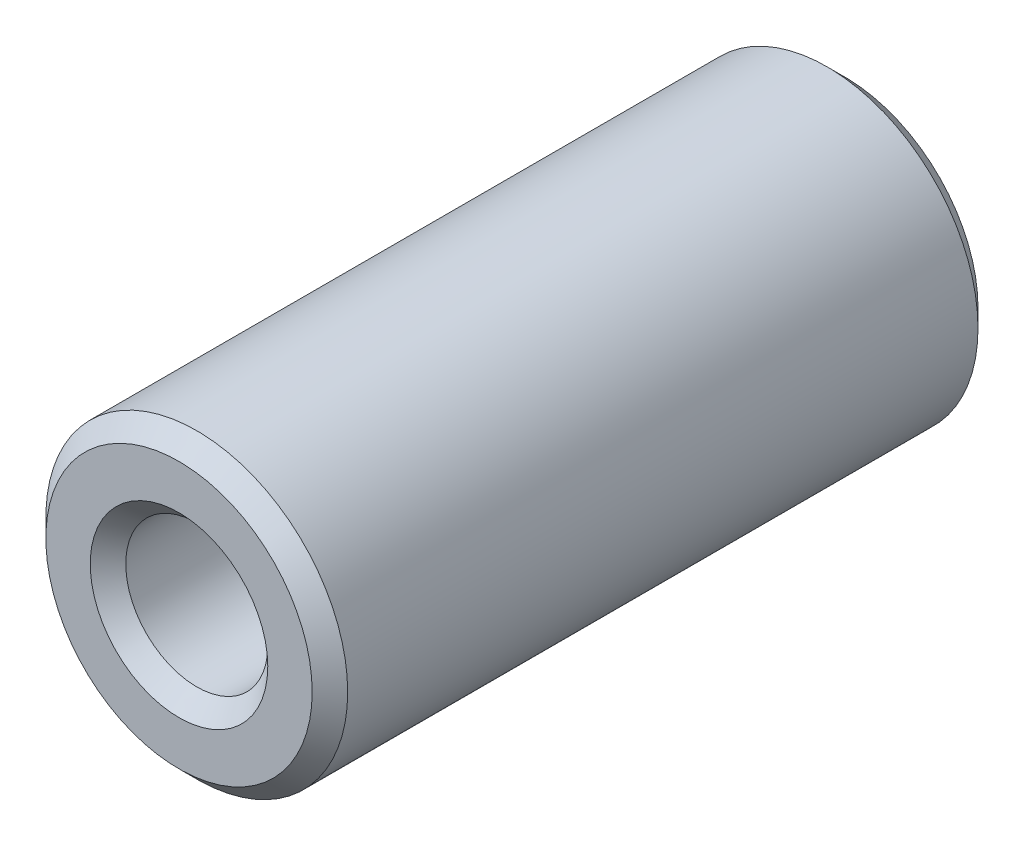
ISO-10303-21;
HEADER;
FILE_DESCRIPTION(('STEP AP214'),'2;1');
FILE_NAME('part.step','',(''),(''),'','','');
FILE_SCHEMA(('AUTOMOTIVE_DESIGN { 1 0 10303 214 1 1 1 1 }'));
ENDSEC;
DATA;
#1=APPLICATION_CONTEXT('core data for automotive mechanical design processes');
#2=APPLICATION_PROTOCOL_DEFINITION('international standard','automotive_design',2000,#1);
#3=PRODUCT_CONTEXT('',#1,'mechanical');
#4=PRODUCT('Part','Part','',(#3));
#5=PRODUCT_RELATED_PRODUCT_CATEGORY('part','',(#4));
#6=PRODUCT_DEFINITION_FORMATION('','',#4);
#7=PRODUCT_DEFINITION_CONTEXT('part definition',#1,'design');
#8=PRODUCT_DEFINITION('design','',#6,#7);
#9=PRODUCT_DEFINITION_SHAPE('','',#8);
#10=(LENGTH_UNIT() NAMED_UNIT(*) SI_UNIT(.MILLI.,.METRE.));
#11=(NAMED_UNIT(*) PLANE_ANGLE_UNIT() SI_UNIT($,.RADIAN.));
#12=(NAMED_UNIT(*) SI_UNIT($,.STERADIAN.) SOLID_ANGLE_UNIT());
#13=UNCERTAINTY_MEASURE_WITH_UNIT(LENGTH_MEASURE(1.E-05),#10,'distance_accuracy_value','');
#14=(GEOMETRIC_REPRESENTATION_CONTEXT(3) GLOBAL_UNCERTAINTY_ASSIGNED_CONTEXT((#13)) GLOBAL_UNIT_ASSIGNED_CONTEXT((#10,
#11,#12)) REPRESENTATION_CONTEXT('',''));
#15=CARTESIAN_POINT('',(0.,0.,0.));
#16=DIRECTION('',(0.,0.,1.));
#17=DIRECTION('',(1.,0.,0.));
#18=AXIS2_PLACEMENT_3D('',#15,#16,#17);
#19=CARTESIAN_POINT('',(0.,0.,75.));
#20=DIRECTION('',(0.,0.,1.));
#21=DIRECTION('',(1.,0.,0.));
#22=AXIS2_PLACEMENT_3D('',#19,#20,#21);
#23=PLANE('',#22);
#24=CARTESIAN_POINT('',(0.,0.,75.));
#25=DIRECTION('',(0.,0.,1.));
#26=DIRECTION('',(1.,0.,0.));
#27=AXIS2_PLACEMENT_3D('',#24,#25,#26);
#28=CIRCLE('',#27,10.);
#29=CARTESIAN_POINT('',(10.,0.,75.));
#30=VERTEX_POINT('',#29);
#31=EDGE_CURVE('E49',#30,#30,#28,.F.);
#32=ORIENTED_EDGE('',*,*,#31,.T.);
#33=EDGE_LOOP('',(#32));
#34=FACE_BOUND('',#33,.T.);
#35=CARTESIAN_POINT('',(0.,0.,75.));
#36=DIRECTION('',(0.,0.,1.));
#37=DIRECTION('',(1.,0.,0.));
#38=AXIS2_PLACEMENT_3D('',#35,#36,#37);
#39=CIRCLE('',#38,15.);
#40=CARTESIAN_POINT('',(15.,0.,75.));
#41=VERTEX_POINT('',#40);
#42=EDGE_CURVE('E53',#41,#41,#39,.T.);
#43=ORIENTED_EDGE('',*,*,#42,.T.);
#44=EDGE_LOOP('',(#43));
#45=FACE_BOUND('',#44,.T.);
#46=ADVANCED_FACE('F37',(#34,#45),#23,.T.);
#47=CARTESIAN_POINT('',(0.,0.,0.));
#48=DIRECTION('',(0.,0.,1.));
#49=DIRECTION('',(1.,0.,0.));
#50=AXIS2_PLACEMENT_3D('',#47,#48,#49);
#51=PLANE('',#50);
#52=CARTESIAN_POINT('',(0.,0.,0.));
#53=DIRECTION('',(0.,0.,1.));
#54=DIRECTION('',(1.,0.,0.));
#55=AXIS2_PLACEMENT_3D('',#52,#53,#54);
#56=CIRCLE('',#55,10.);
#57=CARTESIAN_POINT('',(10.,0.,0.));
#58=VERTEX_POINT('',#57);
#59=EDGE_CURVE('E64',#58,#58,#56,.T.);
#60=ORIENTED_EDGE('',*,*,#59,.T.);
#61=EDGE_LOOP('',(#60));
#62=FACE_BOUND('',#61,.T.);
#63=CARTESIAN_POINT('',(0.,0.,0.));
#64=DIRECTION('',(0.,0.,1.));
#65=DIRECTION('',(1.,0.,0.));
#66=AXIS2_PLACEMENT_3D('',#63,#64,#65);
#67=CIRCLE('',#66,15.);
#68=CARTESIAN_POINT('',(15.,0.,0.));
#69=VERTEX_POINT('',#68);
#70=EDGE_CURVE('E67',#69,#69,#67,.F.);
#71=ORIENTED_EDGE('',*,*,#70,.T.);
#72=EDGE_LOOP('',(#71));
#73=FACE_BOUND('',#72,.T.);
#74=ADVANCED_FACE('F71',(#62,#73),#51,.F.);
#75=CARTESIAN_POINT('',(0.,0.,75.));
#76=DIRECTION('',(0.,0.,-1.));
#77=DIRECTION('',(-1.,0.,0.));
#78=AXIS2_PLACEMENT_3D('',#75,#76,#77);
#79=CYLINDRICAL_SURFACE('',#78,17.);
#80=CARTESIAN_POINT('',(0.,0.,73.));
#81=DIRECTION('',(0.,0.,1.));
#82=DIRECTION('',(1.,0.,0.));
#83=AXIS2_PLACEMENT_3D('',#80,#81,#82);
#84=CIRCLE('',#83,17.);
#85=CARTESIAN_POINT('',(17.,0.,73.));
#86=VERTEX_POINT('',#85);
#87=EDGE_CURVE('E11',#86,#86,#84,.F.);
#88=ORIENTED_EDGE('',*,*,#87,.T.);
#89=EDGE_LOOP('',(#88));
#90=FACE_BOUND('',#89,.T.);
#91=CARTESIAN_POINT('',(0.,0.,2.00000000000002));
#92=DIRECTION('',(0.,0.,1.));
#93=DIRECTION('',(1.,0.,0.));
#94=AXIS2_PLACEMENT_3D('',#91,#92,#93);
#95=CIRCLE('',#94,17.);
#96=CARTESIAN_POINT('',(17.,0.,2.00000000000002));
#97=VERTEX_POINT('',#96);
#98=EDGE_CURVE('E45',#97,#97,#95,.T.);
#99=ORIENTED_EDGE('',*,*,#98,.T.);
#100=EDGE_LOOP('',(#99));
#101=FACE_BOUND('',#100,.T.);
#102=ADVANCED_FACE('F87',(#90,#101),#79,.T.);
#103=CARTESIAN_POINT('',(0.,0.,75.));
#104=DIRECTION('',(0.,0.,-1.));
#105=DIRECTION('',(-1.,0.,0.));
#106=AXIS2_PLACEMENT_3D('',#103,#104,#105);
#107=CYLINDRICAL_SURFACE('',#106,8.);
#108=CARTESIAN_POINT('',(0.,0.,2.));
#109=DIRECTION('',(0.,0.,1.));
#110=DIRECTION('',(1.,0.,0.));
#111=AXIS2_PLACEMENT_3D('',#108,#109,#110);
#112=CIRCLE('',#111,8.);
#113=CARTESIAN_POINT('',(8.,0.,2.));
#114=VERTEX_POINT('',#113);
#115=EDGE_CURVE('E58',#114,#114,#112,.F.);
#116=ORIENTED_EDGE('',*,*,#115,.T.);
#117=EDGE_LOOP('',(#116));
#118=FACE_BOUND('',#117,.T.);
#119=CARTESIAN_POINT('',(0.,0.,73.));
#120=DIRECTION('',(0.,0.,1.));
#121=DIRECTION('',(1.,0.,0.));
#122=AXIS2_PLACEMENT_3D('',#119,#120,#121);
#123=CIRCLE('',#122,8.);
#124=CARTESIAN_POINT('',(8.,0.,73.));
#125=VERTEX_POINT('',#124);
#126=EDGE_CURVE('E61',#125,#125,#123,.T.);
#127=ORIENTED_EDGE('',*,*,#126,.T.);
#128=EDGE_LOOP('',(#127));
#129=FACE_BOUND('',#128,.T.);
#130=ADVANCED_FACE('F92',(#118,#129),#107,.F.);
#131=CARTESIAN_POINT('',(0.,0.,0.));
#132=DIRECTION('',(0.,0.,-1.));
#133=DIRECTION('',(-1.,0.,0.));
#134=AXIS2_PLACEMENT_3D('',#131,#132,#133);
#135=CONICAL_SURFACE('',#134,10.,0.785398163397448);
#136=ORIENTED_EDGE('',*,*,#115,.F.);
#137=EDGE_LOOP('',(#136));
#138=FACE_BOUND('',#137,.T.);
#139=ORIENTED_EDGE('',*,*,#59,.F.);
#140=EDGE_LOOP('',(#139));
#141=FACE_BOUND('',#140,.T.);
#142=ADVANCED_FACE('F97',(#138,#141),#135,.F.);
#143=CARTESIAN_POINT('',(0.,0.,73.));
#144=DIRECTION('',(0.,0.,1.));
#145=DIRECTION('',(1.,0.,0.));
#146=AXIS2_PLACEMENT_3D('',#143,#144,#145);
#147=CONICAL_SURFACE('',#146,8.,0.785398163397457);
#148=ORIENTED_EDGE('',*,*,#31,.F.);
#149=EDGE_LOOP('',(#148));
#150=FACE_BOUND('',#149,.T.);
#151=ORIENTED_EDGE('',*,*,#126,.F.);
#152=EDGE_LOOP('',(#151));
#153=FACE_BOUND('',#152,.T.);
#154=ADVANCED_FACE('F79',(#150,#153),#147,.F.);
#155=CARTESIAN_POINT('',(0.,0.,75.));
#156=DIRECTION('',(0.,0.,-1.));
#157=DIRECTION('',(-1.,0.,0.));
#158=AXIS2_PLACEMENT_3D('',#155,#156,#157);
#159=CONICAL_SURFACE('',#158,15.,0.785398163397448);
#160=ORIENTED_EDGE('',*,*,#87,.F.);
#161=EDGE_LOOP('',(#160));
#162=FACE_BOUND('',#161,.T.);
#163=ORIENTED_EDGE('',*,*,#42,.F.);
#164=EDGE_LOOP('',(#163));
#165=FACE_BOUND('',#164,.T.);
#166=ADVANCED_FACE('F75',(#162,#165),#159,.T.);
#167=CARTESIAN_POINT('',(0.,0.,2.00000000000002));
#168=DIRECTION('',(0.,0.,1.));
#169=DIRECTION('',(1.,0.,0.));
#170=AXIS2_PLACEMENT_3D('',#167,#168,#169);
#171=CONICAL_SURFACE('',#170,17.,0.785398163397448);
#172=ORIENTED_EDGE('',*,*,#70,.F.);
#173=EDGE_LOOP('',(#172));
#174=FACE_BOUND('',#173,.T.);
#175=ORIENTED_EDGE('',*,*,#98,.F.);
#176=EDGE_LOOP('',(#175));
#177=FACE_BOUND('',#176,.T.);
#178=ADVANCED_FACE('F40',(#174,#177),#171,.T.);
#179=CLOSED_SHELL('',(#46,#74,#102,#130,#142,#154,#166,#178));
#180=MANIFOLD_SOLID_BREP('B2',#179);
#181=ADVANCED_BREP_SHAPE_REPRESENTATION('',(#18,#180),#14);
#182=SHAPE_DEFINITION_REPRESENTATION(#9,#181);
ENDSEC;
END-ISO-10303-21;
